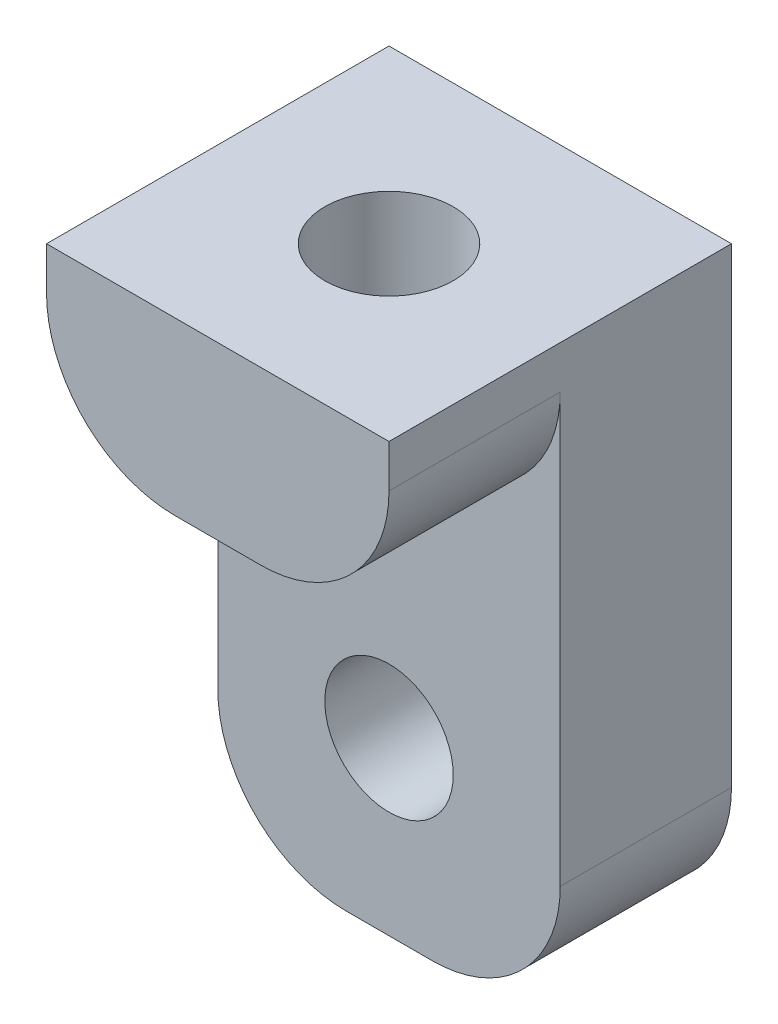
ISO-10303-21;
HEADER;
FILE_DESCRIPTION(('STEP AP214'),'2;1');
FILE_NAME('part.step','',(''),(''),'','','');
FILE_SCHEMA(('AUTOMOTIVE_DESIGN { 1 0 10303 214 1 1 1 1 }'));
ENDSEC;
DATA;
#1=APPLICATION_CONTEXT('core data for automotive mechanical design processes');
#2=APPLICATION_PROTOCOL_DEFINITION('international standard','automotive_design',2000,#1);
#3=PRODUCT_CONTEXT('',#1,'mechanical');
#4=PRODUCT('Part','Part','',(#3));
#5=PRODUCT_RELATED_PRODUCT_CATEGORY('part','',(#4));
#6=PRODUCT_DEFINITION_FORMATION('','',#4);
#7=PRODUCT_DEFINITION_CONTEXT('part definition',#1,'design');
#8=PRODUCT_DEFINITION('design','',#6,#7);
#9=PRODUCT_DEFINITION_SHAPE('','',#8);
#10=(LENGTH_UNIT() NAMED_UNIT(*) SI_UNIT(.MILLI.,.METRE.));
#11=(NAMED_UNIT(*) PLANE_ANGLE_UNIT() SI_UNIT($,.RADIAN.));
#12=(NAMED_UNIT(*) SI_UNIT($,.STERADIAN.) SOLID_ANGLE_UNIT());
#13=UNCERTAINTY_MEASURE_WITH_UNIT(LENGTH_MEASURE(1.E-05),#10,'distance_accuracy_value','');
#14=(GEOMETRIC_REPRESENTATION_CONTEXT(3) GLOBAL_UNCERTAINTY_ASSIGNED_CONTEXT((#13)) GLOBAL_UNIT_ASSIGNED_CONTEXT((#10,
#11,#12)) REPRESENTATION_CONTEXT('',''));
#15=CARTESIAN_POINT('',(0.,0.,0.));
#16=DIRECTION('',(0.,0.,1.));
#17=DIRECTION('',(1.,0.,0.));
#18=AXIS2_PLACEMENT_3D('',#15,#16,#17);
#19=CARTESIAN_POINT('',(0.,30.,0.));
#20=DIRECTION('',(0.,1.,0.));
#21=DIRECTION('',(0.,0.,1.));
#22=AXIS2_PLACEMENT_3D('',#19,#20,#21);
#23=PLANE('',#22);
#24=CARTESIAN_POINT('',(0.,30.,20.));
#25=DIRECTION('',(0.,1.,0.));
#26=DIRECTION('',(0.,0.,1.));
#27=AXIS2_PLACEMENT_3D('',#24,#25,#26);
#28=CIRCLE('',#27,7.5);
#29=CARTESIAN_POINT('',(7.5,30.,20.));
#30=VERTEX_POINT('',#29);
#31=CARTESIAN_POINT('',(-7.5,30.,20.));
#32=VERTEX_POINT('',#31);
#33=EDGE_CURVE('E50',#30,#32,#28,.T.);
#34=ORIENTED_EDGE('',*,*,#33,.T.);
#35=DIRECTION('',(1.,0.,0.));
#36=VECTOR('',#35,1.);
#37=CARTESIAN_POINT('',(-20.,30.,20.));
#38=LINE('',#37,#36);
#39=EDGE_CURVE('E53',#32,#30,#38,.T.);
#40=ORIENTED_EDGE('',*,*,#39,.T.);
#41=EDGE_LOOP('',(#34,#40));
#42=FACE_BOUND('',#41,.T.);
#43=ADVANCED_FACE('F36',(#42),#23,.T.);
#44=CARTESIAN_POINT('',(0.,0.,40.));
#45=DIRECTION('',(0.,0.,1.));
#46=DIRECTION('',(1.,0.,0.));
#47=AXIS2_PLACEMENT_3D('',#44,#45,#46);
#48=PLANE('',#47);
#49=DIRECTION('',(0.,-1.,0.));
#50=VECTOR('',#49,1.);
#51=CARTESIAN_POINT('',(-20.,50.,40.));
#52=LINE('',#51,#50);
#53=CARTESIAN_POINT('',(-20.,50.,40.));
#54=VERTEX_POINT('',#53);
#55=CARTESIAN_POINT('',(-20.,45.,40.));
#56=VERTEX_POINT('',#55);
#57=EDGE_CURVE('E133',#54,#56,#52,.T.);
#58=ORIENTED_EDGE('',*,*,#57,.T.);
#59=CARTESIAN_POINT('',(-5.00000000000001,45.,40.));
#60=DIRECTION('',(0.,0.,1.));
#61=DIRECTION('',(1.,0.,0.));
#62=AXIS2_PLACEMENT_3D('',#59,#60,#61);
#63=CIRCLE('',#62,15.);
#64=CARTESIAN_POINT('',(-5.00000000000001,30.,40.));
#65=VERTEX_POINT('',#64);
#66=EDGE_CURVE('E173',#56,#65,#63,.T.);
#67=ORIENTED_EDGE('',*,*,#66,.T.);
#68=DIRECTION('',(1.,0.,0.));
#69=VECTOR('',#68,1.);
#70=CARTESIAN_POINT('',(-20.,30.,40.));
#71=LINE('',#70,#69);
#72=CARTESIAN_POINT('',(5.00000000000001,30.,40.));
#73=VERTEX_POINT('',#72);
#74=EDGE_CURVE('E375',#65,#73,#71,.T.);
#75=ORIENTED_EDGE('',*,*,#74,.T.);
#76=CARTESIAN_POINT('',(5.00000000000001,45.,40.));
#77=DIRECTION('',(0.,0.,1.));
#78=DIRECTION('',(1.,0.,0.));
#79=AXIS2_PLACEMENT_3D('',#76,#77,#78);
#80=CIRCLE('',#79,15.);
#81=CARTESIAN_POINT('',(20.,45.,40.));
#82=VERTEX_POINT('',#81);
#83=EDGE_CURVE('E129',#73,#82,#80,.T.);
#84=ORIENTED_EDGE('',*,*,#83,.T.);
#85=DIRECTION('',(0.,1.,0.));
#86=VECTOR('',#85,1.);
#87=CARTESIAN_POINT('',(20.,50.,40.));
#88=LINE('',#87,#86);
#89=CARTESIAN_POINT('',(20.,50.,40.));
#90=VERTEX_POINT('',#89);
#91=EDGE_CURVE('E121',#82,#90,#88,.T.);
#92=ORIENTED_EDGE('',*,*,#91,.T.);
#93=DIRECTION('',(-1.,0.,0.));
#94=VECTOR('',#93,1.);
#95=CARTESIAN_POINT('',(-20.,50.,40.));
#96=LINE('',#95,#94);
#97=EDGE_CURVE('E126',#90,#54,#96,.T.);
#98=ORIENTED_EDGE('',*,*,#97,.T.);
#99=EDGE_LOOP('',(#58,#67,#75,#84,#92,#98));
#100=FACE_BOUND('',#99,.T.);
#101=ADVANCED_FACE('F124',(#100),#48,.T.);
#102=CARTESIAN_POINT('',(-20.,50.,40.));
#103=DIRECTION('',(1.,0.,0.));
#104=DIRECTION('',(0.,1.,0.));
#105=AXIS2_PLACEMENT_3D('',#102,#103,#104);
#106=PLANE('',#105);
#107=DIRECTION('',(0.,1.,0.));
#108=VECTOR('',#107,1.);
#109=CARTESIAN_POINT('',(-20.,-20.,20.));
#110=LINE('',#109,#108);
#111=CARTESIAN_POINT('',(-20.,-5.,20.));
#112=VERTEX_POINT('',#111);
#113=CARTESIAN_POINT('',(-20.,45.,20.));
#114=VERTEX_POINT('',#113);
#115=EDGE_CURVE('E167',#112,#114,#110,.T.);
#116=ORIENTED_EDGE('',*,*,#115,.T.);
#117=DIRECTION('',(0.,0.,1.));
#118=VECTOR('',#117,1.);
#119=CARTESIAN_POINT('',(-20.,45.,40.));
#120=LINE('',#119,#118);
#121=EDGE_CURVE('E169',#114,#56,#120,.T.);
#122=ORIENTED_EDGE('',*,*,#121,.T.);
#123=ORIENTED_EDGE('',*,*,#57,.F.);
#124=DIRECTION('',(0.,0.,-1.));
#125=VECTOR('',#124,1.);
#126=CARTESIAN_POINT('',(-20.,50.,40.));
#127=LINE('',#126,#125);
#128=CARTESIAN_POINT('',(-20.,50.,0.));
#129=VERTEX_POINT('',#128);
#130=EDGE_CURVE('E144',#54,#129,#127,.T.);
#131=ORIENTED_EDGE('',*,*,#130,.T.);
#132=DIRECTION('',(0.,-1.,0.));
#133=VECTOR('',#132,1.);
#134=CARTESIAN_POINT('',(-20.,50.,0.));
#135=LINE('',#134,#133);
#136=CARTESIAN_POINT('',(-20.,-5.,0.));
#137=VERTEX_POINT('',#136);
#138=EDGE_CURVE('E153',#129,#137,#135,.T.);
#139=ORIENTED_EDGE('',*,*,#138,.T.);
#140=DIRECTION('',(0.,0.,-1.));
#141=VECTOR('',#140,1.);
#142=CARTESIAN_POINT('',(-20.,-5.,40.));
#143=LINE('',#142,#141);
#144=EDGE_CURVE('E143',#137,#112,#143,.F.);
#145=ORIENTED_EDGE('',*,*,#144,.T.);
#146=EDGE_LOOP('',(#116,#122,#123,#131,#139,#145));
#147=FACE_BOUND('',#146,.T.);
#148=ADVANCED_FACE('F214',(#147),#106,.F.);
#149=CARTESIAN_POINT('',(-20.,-20.,40.));
#150=DIRECTION('',(0.,1.,0.));
#151=DIRECTION('',(0.,0.,1.));
#152=AXIS2_PLACEMENT_3D('',#149,#150,#151);
#153=PLANE('',#152);
#154=DIRECTION('',(1.,0.,0.));
#155=VECTOR('',#154,1.);
#156=CARTESIAN_POINT('',(-20.,-20.,0.));
#157=LINE('',#156,#155);
#158=CARTESIAN_POINT('',(-5.,-20.,0.));
#159=VERTEX_POINT('',#158);
#160=CARTESIAN_POINT('',(5.,-20.,0.));
#161=VERTEX_POINT('',#160);
#162=EDGE_CURVE('E156',#159,#161,#157,.T.);
#163=ORIENTED_EDGE('',*,*,#162,.T.);
#164=DIRECTION('',(0.,0.,-1.));
#165=VECTOR('',#164,1.);
#166=CARTESIAN_POINT('',(5.,-20.,40.));
#167=LINE('',#166,#165);
#168=CARTESIAN_POINT('',(5.,-20.,20.));
#169=VERTEX_POINT('',#168);
#170=EDGE_CURVE('E329',#161,#169,#167,.F.);
#171=ORIENTED_EDGE('',*,*,#170,.T.);
#172=DIRECTION('',(1.,0.,0.));
#173=VECTOR('',#172,1.);
#174=CARTESIAN_POINT('',(-20.,-20.,20.));
#175=LINE('',#174,#173);
#176=CARTESIAN_POINT('',(-5.,-20.,20.));
#177=VERTEX_POINT('',#176);
#178=EDGE_CURVE('E367',#177,#169,#175,.T.);
#179=ORIENTED_EDGE('',*,*,#178,.F.);
#180=DIRECTION('',(0.,0.,-1.));
#181=VECTOR('',#180,1.);
#182=CARTESIAN_POINT('',(-5.,-20.,40.));
#183=LINE('',#182,#181);
#184=EDGE_CURVE('E323',#177,#159,#183,.T.);
#185=ORIENTED_EDGE('',*,*,#184,.T.);
#186=EDGE_LOOP('',(#163,#171,#179,#185));
#187=FACE_BOUND('',#186,.T.);
#188=ADVANCED_FACE('F223',(#187),#153,.F.);
#189=CARTESIAN_POINT('',(20.,50.,40.));
#190=DIRECTION('',(-1.,0.,0.));
#191=DIRECTION('',(0.,-1.,0.));
#192=AXIS2_PLACEMENT_3D('',#189,#190,#191);
#193=PLANE('',#192);
#194=ORIENTED_EDGE('',*,*,#91,.F.);
#195=DIRECTION('',(0.,0.,1.));
#196=VECTOR('',#195,1.);
#197=CARTESIAN_POINT('',(20.,45.,20.));
#198=LINE('',#197,#196);
#199=CARTESIAN_POINT('',(20.,45.,20.));
#200=VERTEX_POINT('',#199);
#201=EDGE_CURVE('E357',#82,#200,#198,.F.);
#202=ORIENTED_EDGE('',*,*,#201,.T.);
#203=DIRECTION('',(0.,1.,0.));
#204=VECTOR('',#203,1.);
#205=CARTESIAN_POINT('',(20.,-20.,20.));
#206=LINE('',#205,#204);
#207=CARTESIAN_POINT('',(20.,-5.00000000000001,20.));
#208=VERTEX_POINT('',#207);
#209=EDGE_CURVE('E372',#208,#200,#206,.T.);
#210=ORIENTED_EDGE('',*,*,#209,.F.);
#211=DIRECTION('',(0.,0.,-1.));
#212=VECTOR('',#211,1.);
#213=CARTESIAN_POINT('',(20.,-5.,40.));
#214=LINE('',#213,#212);
#215=CARTESIAN_POINT('',(20.,-5.,0.));
#216=VERTEX_POINT('',#215);
#217=EDGE_CURVE('E360',#208,#216,#214,.T.);
#218=ORIENTED_EDGE('',*,*,#217,.T.);
#219=DIRECTION('',(0.,1.,0.));
#220=VECTOR('',#219,1.);
#221=CARTESIAN_POINT('',(20.,50.,0.));
#222=LINE('',#221,#220);
#223=CARTESIAN_POINT('',(20.,50.,0.));
#224=VERTEX_POINT('',#223);
#225=EDGE_CURVE('E140',#216,#224,#222,.T.);
#226=ORIENTED_EDGE('',*,*,#225,.T.);
#227=DIRECTION('',(0.,0.,-1.));
#228=VECTOR('',#227,1.);
#229=CARTESIAN_POINT('',(20.,50.,40.));
#230=LINE('',#229,#228);
#231=EDGE_CURVE('E136',#90,#224,#230,.T.);
#232=ORIENTED_EDGE('',*,*,#231,.F.);
#233=EDGE_LOOP('',(#194,#202,#210,#218,#226,#232));
#234=FACE_BOUND('',#233,.T.);
#235=ADVANCED_FACE('F137',(#234),#193,.F.);
#236=CARTESIAN_POINT('',(0.,0.,40.));
#237=DIRECTION('',(0.,0.,-1.));
#238=DIRECTION('',(-1.,0.,0.));
#239=AXIS2_PLACEMENT_3D('',#236,#237,#238);
#240=CYLINDRICAL_SURFACE('',#239,7.5);
#241=CARTESIAN_POINT('',(0.,0.,0.));
#242=DIRECTION('',(0.,0.,1.));
#243=DIRECTION('',(1.,0.,0.));
#244=AXIS2_PLACEMENT_3D('',#241,#242,#243);
#245=CIRCLE('',#244,7.5);
#246=CARTESIAN_POINT('',(7.5,0.,0.));
#247=VERTEX_POINT('',#246);
#248=EDGE_CURVE('E157',#247,#247,#245,.T.);
#249=ORIENTED_EDGE('',*,*,#248,.F.);
#250=EDGE_LOOP('',(#249));
#251=FACE_BOUND('',#250,.T.);
#252=CARTESIAN_POINT('',(0.,0.,20.));
#253=DIRECTION('',(0.,0.,1.));
#254=DIRECTION('',(1.,0.,0.));
#255=AXIS2_PLACEMENT_3D('',#252,#253,#254);
#256=CIRCLE('',#255,7.5);
#257=CARTESIAN_POINT('',(7.5,0.,20.));
#258=VERTEX_POINT('',#257);
#259=EDGE_CURVE('E163',#258,#258,#256,.T.);
#260=ORIENTED_EDGE('',*,*,#259,.T.);
#261=EDGE_LOOP('',(#260));
#262=FACE_BOUND('',#261,.T.);
#263=ADVANCED_FACE('F206',(#251,#262),#240,.F.);
#264=CARTESIAN_POINT('',(0.,0.,0.));
#265=DIRECTION('',(0.,0.,1.));
#266=DIRECTION('',(1.,0.,0.));
#267=AXIS2_PLACEMENT_3D('',#264,#265,#266);
#268=PLANE('',#267);
#269=ORIENTED_EDGE('',*,*,#225,.F.);
#270=CARTESIAN_POINT('',(5.,-5.,0.));
#271=DIRECTION('',(0.,0.,1.));
#272=DIRECTION('',(1.,0.,0.));
#273=AXIS2_PLACEMENT_3D('',#270,#271,#272);
#274=CIRCLE('',#273,15.);
#275=EDGE_CURVE('E362',#216,#161,#274,.F.);
#276=ORIENTED_EDGE('',*,*,#275,.T.);
#277=ORIENTED_EDGE('',*,*,#162,.F.);
#278=CARTESIAN_POINT('',(-5.,-5.,0.));
#279=DIRECTION('',(0.,0.,1.));
#280=DIRECTION('',(1.,0.,0.));
#281=AXIS2_PLACEMENT_3D('',#278,#279,#280);
#282=CIRCLE('',#281,15.);
#283=EDGE_CURVE('E359',#159,#137,#282,.F.);
#284=ORIENTED_EDGE('',*,*,#283,.T.);
#285=ORIENTED_EDGE('',*,*,#138,.F.);
#286=DIRECTION('',(-1.,0.,0.));
#287=VECTOR('',#286,1.);
#288=CARTESIAN_POINT('',(-20.,50.,0.));
#289=LINE('',#288,#287);
#290=EDGE_CURVE('E161',#224,#129,#289,.T.);
#291=ORIENTED_EDGE('',*,*,#290,.F.);
#292=EDGE_LOOP('',(#269,#276,#277,#284,#285,#291));
#293=FACE_BOUND('',#292,.T.);
#294=ORIENTED_EDGE('',*,*,#248,.T.);
#295=EDGE_LOOP('',(#294));
#296=FACE_BOUND('',#295,.T.);
#297=ADVANCED_FACE('F210',(#293,#296),#268,.F.);
#298=CARTESIAN_POINT('',(-20.,50.,40.));
#299=DIRECTION('',(0.,-1.,0.));
#300=DIRECTION('',(0.,0.,-1.));
#301=AXIS2_PLACEMENT_3D('',#298,#299,#300);
#302=PLANE('',#301);
#303=CARTESIAN_POINT('',(0.,50.,20.));
#304=DIRECTION('',(0.,1.,0.));
#305=DIRECTION('',(0.,0.,1.));
#306=AXIS2_PLACEMENT_3D('',#303,#304,#305);
#307=CIRCLE('',#306,7.5);
#308=CARTESIAN_POINT('',(0.,50.,27.5));
#309=VERTEX_POINT('',#308);
#310=EDGE_CURVE('E347',#309,#309,#307,.T.);
#311=ORIENTED_EDGE('',*,*,#310,.F.);
#312=EDGE_LOOP('',(#311));
#313=FACE_BOUND('',#312,.T.);
#314=ORIENTED_EDGE('',*,*,#290,.T.);
#315=ORIENTED_EDGE('',*,*,#130,.F.);
#316=ORIENTED_EDGE('',*,*,#97,.F.);
#317=ORIENTED_EDGE('',*,*,#231,.T.);
#318=EDGE_LOOP('',(#314,#315,#316,#317));
#319=FACE_BOUND('',#318,.T.);
#320=ADVANCED_FACE('F146',(#313,#319),#302,.F.);
#321=CARTESIAN_POINT('',(0.,30.,20.));
#322=DIRECTION('',(0.,1.,0.));
#323=DIRECTION('',(0.,0.,1.));
#324=AXIS2_PLACEMENT_3D('',#321,#322,#323);
#325=CYLINDRICAL_SURFACE('',#324,7.5);
#326=CARTESIAN_POINT('',(-5.00000000000001,30.,25.5901699437495));
#327=VERTEX_POINT('',#326);
#328=CARTESIAN_POINT('',(5.00000000000001,30.,25.5901699437495));
#329=VERTEX_POINT('',#328);
#330=EDGE_CURVE('E166',#327,#329,#28,.T.);
#331=ORIENTED_EDGE('',*,*,#330,.F.);
#332=CARTESIAN_POINT('',(-5.00000000000001,30.,25.5901699437495));
#333=CARTESIAN_POINT('',(-5.15663344575459,29.9999978303104,25.4501051414938));
#334=CARTESIAN_POINT('',(-5.3073275431487,30.0024537237757,25.3034421050508));
#335=CARTESIAN_POINT('',(-5.59580804645587,30.0111435883526,24.9980934292791));
#336=CARTESIAN_POINT('',(-5.73359757609519,30.0173766424079,24.8394107163865));
#337=CARTESIAN_POINT('',(-5.9952148366046,30.0324779884707,24.5112555362672));
#338=CARTESIAN_POINT('',(-6.11905337737117,30.0413442205223,24.3417915844213));
#339=CARTESIAN_POINT('',(-6.35206901812086,30.0606030984697,23.9931413005001));
#340=CARTESIAN_POINT('',(-6.46124549102694,30.0709958096114,23.8139545530537));
#341=CARTESIAN_POINT('',(-6.66418146031627,30.0922532551697,23.4471174990133));
#342=CARTESIAN_POINT('',(-6.75794330805307,30.1031179172747,23.2594684888317));
#343=CARTESIAN_POINT('',(-6.92943411166735,30.1243570340514,22.8769554999541));
#344=CARTESIAN_POINT('',(-7.00716314928027,30.1347314912221,22.6820915580459));
#345=CARTESIAN_POINT('',(-7.14603413692196,30.1541434492909,22.2865105169181));
#346=CARTESIAN_POINT('',(-7.20717888242539,30.1631811753936,22.0857944104737));
#347=CARTESIAN_POINT('',(-7.31245566261449,30.1792244585586,21.6798679055726));
#348=CARTESIAN_POINT('',(-7.35658773370456,30.1862300199695,21.4746575167339));
#349=CARTESIAN_POINT('',(-7.42766500485304,30.197711400443,21.0602728203928));
#350=CARTESIAN_POINT('',(-7.45453326021265,30.2021758839963,20.8510849871964));
#351=CARTESIAN_POINT('',(-7.4905623375704,30.2081970563272,20.4311464946836));
#352=CARTESIAN_POINT('',(-7.49972308710657,30.2097537332054,20.2203958289755));
#353=CARTESIAN_POINT('',(-7.50026453144197,30.209845257095,19.7988770384197));
#354=CARTESIAN_POINT('',(-7.49164572593858,30.208380189033,19.5881089142293));
#355=CARTESIAN_POINT('',(-7.4566972072208,30.2025356376118,19.168089030511));
#356=CARTESIAN_POINT('',(-7.43036763231109,30.1981561770114,18.9588372591547));
#357=CARTESIAN_POINT('',(-7.36064799928905,30.1868785261535,18.5459946810235));
#358=CARTESIAN_POINT('',(-7.31747808101943,30.1800129151642,18.3423657457407));
#359=CARTESIAN_POINT('',(-7.21436986767921,30.1642565396045,17.9393826214284));
#360=CARTESIAN_POINT('',(-7.1544240551411,30.155364867466,17.7400303920576));
#361=CARTESIAN_POINT('',(-7.01818739304532,30.136230367199,17.3470188916852));
#362=CARTESIAN_POINT('',(-6.94189353402911,30.1259872904285,17.1533606763506));
#363=CARTESIAN_POINT('',(-6.77353044043229,30.1049746885494,16.7731604847035));
#364=CARTESIAN_POINT('',(-6.68146805943197,30.0942053936019,16.5866154596231));
#365=CARTESIAN_POINT('',(-6.47973744880901,30.0728131023185,16.2173651672977));
#366=CARTESIAN_POINT('',(-6.36969614342315,30.0622000006072,16.0348629815442));
#367=CARTESIAN_POINT('',(-6.13444857364372,30.0424950294228,15.6798268314861));
#368=CARTESIAN_POINT('',(-6.00924263972168,30.0334031268096,15.5072926500773));
#369=CARTESIAN_POINT('',(-5.74439588116251,30.0178948657955,15.1732662989898));
#370=CARTESIAN_POINT('',(-5.60474096731799,30.0114811501685,15.0117851669272));
#371=CARTESIAN_POINT('',(-5.31210296626037,30.0025321683687,14.7012075626924));
#372=CARTESIAN_POINT('',(-5.15911680082515,29.9999978004693,14.5521139664433));
#373=CARTESIAN_POINT('',(-5.00000000000001,30.,14.4098300562505));
#374=B_SPLINE_CURVE_WITH_KNOTS('',3,(#332,#333,#334,#335,#336,#337,#338,#339,#340,#341,#342,
#343,#344,#345,#346,#347,#348,#349,#350,#351,#352,#353,#354,#355,#356,#357,#358,#359,#360,#361,
#362,#363,#364,#365,#366,#367,#368,#369,#370,#371,#372,#373),.UNSPECIFIED.,.F.,.F.,(4,2,2,2,2,2,
2,2,2,2,2,2,2,2,2,2,2,2,2,2,4),(0.,0.630131786436628,1.26011064450682,1.88959795754474,
2.51911218434564,3.14853029549866,3.77794519779274,4.40725393888138,5.03656133334271,
5.66865443913941,6.30075013155758,6.93282805906215,7.56490105068162,8.18897434663032,
8.81332774589868,9.43779617923999,10.0619938811669,10.7013413169057,11.3406748223251,
11.9806377250904,12.620748790577),.UNSPECIFIED.);
#375=CARTESIAN_POINT('',(-7.5,30.209800542251,20.));
#376=VERTEX_POINT('',#375);
#377=EDGE_CURVE('E189',#327,#376,#374,.T.);
#378=ORIENTED_EDGE('',*,*,#377,.T.);
#379=DIRECTION('',(0.,1.,0.));
#380=VECTOR('',#379,1.);
#381=CARTESIAN_POINT('',(-7.5,30.,20.));
#382=LINE('',#381,#380);
#383=EDGE_CURVE('E11',#376,#32,#382,.F.);
#384=ORIENTED_EDGE('',*,*,#383,.T.);
#385=ORIENTED_EDGE('',*,*,#33,.F.);
#386=DIRECTION('',(0.,1.,0.));
#387=VECTOR('',#386,1.);
#388=CARTESIAN_POINT('',(7.5,30.,20.));
#389=LINE('',#388,#387);
#390=CARTESIAN_POINT('',(7.5,30.209800542251,20.));
#391=VERTEX_POINT('',#390);
#392=EDGE_CURVE('E44',#391,#30,#389,.F.);
#393=ORIENTED_EDGE('',*,*,#392,.F.);
#394=CARTESIAN_POINT('',(5.00000000000001,30.,14.4098300562505));
#395=CARTESIAN_POINT('',(5.15663344575459,29.9999978303104,14.5498948585062));
#396=CARTESIAN_POINT('',(5.30732754314871,30.0024537237757,14.6965578949492));
#397=CARTESIAN_POINT('',(5.59580804645587,30.0111435883526,15.0019065707209));
#398=CARTESIAN_POINT('',(5.7335975760952,30.0173766424079,15.1605892836135));
#399=CARTESIAN_POINT('',(5.9952148366046,30.0324779884707,15.4887444637328));
#400=CARTESIAN_POINT('',(6.11905337737117,30.0413442205223,15.6582084155787));
#401=CARTESIAN_POINT('',(6.35206901812087,30.0606030984697,16.0068586994999));
#402=CARTESIAN_POINT('',(6.46124549102694,30.0709958096114,16.1860454469463));
#403=CARTESIAN_POINT('',(6.66418146031628,30.0922532551697,16.5528825009867));
#404=CARTESIAN_POINT('',(6.75794330805307,30.1031179172747,16.7405315111683));
#405=CARTESIAN_POINT('',(6.92943411166736,30.1243570340514,17.1230445000459));
#406=CARTESIAN_POINT('',(7.00716314928027,30.1347314912221,17.3179084419541));
#407=CARTESIAN_POINT('',(7.14603413692196,30.1541434492909,17.7134894830819));
#408=CARTESIAN_POINT('',(7.20717888242539,30.1631811753936,17.9142055895263));
#409=CARTESIAN_POINT('',(7.3124556626145,30.1792244585586,18.3201320944274));
#410=CARTESIAN_POINT('',(7.35658773370457,30.1862300199695,18.5253424832661));
#411=CARTESIAN_POINT('',(7.42766500485304,30.197711400443,18.9397271796072));
#412=CARTESIAN_POINT('',(7.45453326021265,30.2021758839963,19.1489150128036));
#413=CARTESIAN_POINT('',(7.4905623375704,30.2081970563272,19.5688535053164));
#414=CARTESIAN_POINT('',(7.49972308710657,30.2097537332054,19.7796041710245));
#415=CARTESIAN_POINT('',(7.50026453144198,30.209845257095,20.2011229615803));
#416=CARTESIAN_POINT('',(7.49164572593859,30.208380189033,20.4118910857707));
#417=CARTESIAN_POINT('',(7.45669720722081,30.2025356376118,20.831910969489));
#418=CARTESIAN_POINT('',(7.4303676323111,30.1981561770114,21.0411627408453));
#419=CARTESIAN_POINT('',(7.36064799928906,30.1868785261535,21.4540053189765));
#420=CARTESIAN_POINT('',(7.31747808101944,30.1800129151642,21.6576342542593));
#421=CARTESIAN_POINT('',(7.21436986767922,30.1642565396045,22.0606173785716));
#422=CARTESIAN_POINT('',(7.15442405514111,30.155364867466,22.2599696079424));
#423=CARTESIAN_POINT('',(7.01818739304532,30.136230367199,22.6529811083148));
#424=CARTESIAN_POINT('',(6.94189353402912,30.1259872904285,22.8466393236494));
#425=CARTESIAN_POINT('',(6.7735304404323,30.1049746885494,23.2268395152965));
#426=CARTESIAN_POINT('',(6.68146805943198,30.0942053936019,23.4133845403769));
#427=CARTESIAN_POINT('',(6.47973744880902,30.0728131023185,23.7826348327023));
#428=CARTESIAN_POINT('',(6.36969614342316,30.0622000006072,23.9651370184558));
#429=CARTESIAN_POINT('',(6.13444857364373,30.0424950294228,24.3201731685139));
#430=CARTESIAN_POINT('',(6.00924263972169,30.0334031268096,24.4927073499227));
#431=CARTESIAN_POINT('',(5.74439588116252,30.0178948657955,24.8267337010102));
#432=CARTESIAN_POINT('',(5.604740967318,30.0114811501685,24.9882148330728));
#433=CARTESIAN_POINT('',(5.31210296626037,30.0025321683687,25.2987924373076));
#434=CARTESIAN_POINT('',(5.15911680082516,29.9999978004693,25.4478860335567));
#435=CARTESIAN_POINT('',(5.00000000000001,30.,25.5901699437495));
#436=B_SPLINE_CURVE_WITH_KNOTS('',3,(#394,#395,#396,#397,#398,#399,#400,#401,#402,#403,#404,
#405,#406,#407,#408,#409,#410,#411,#412,#413,#414,#415,#416,#417,#418,#419,#420,#421,#422,#423,
#424,#425,#426,#427,#428,#429,#430,#431,#432,#433,#434,#435),.UNSPECIFIED.,.F.,.F.,(4,2,2,2,2,2,
2,2,2,2,2,2,2,2,2,2,2,2,2,2,4),(0.,0.630131786436628,1.26011064450682,1.88959795754474,
2.51911218434564,3.14853029549866,3.77794519779275,4.40725393888139,5.03656133334272,
5.66865443913942,6.30075013155758,6.93282805906215,7.56490105068163,8.18897434663033,
8.81332774589869,9.43779617923999,10.0619938811669,10.7013413169057,11.3406748223252,
11.9806377250904,12.620748790577),.UNSPECIFIED.);
#437=EDGE_CURVE('E181',#391,#329,#436,.T.);
#438=ORIENTED_EDGE('',*,*,#437,.T.);
#439=EDGE_LOOP('',(#331,#378,#384,#385,#393,#438));
#440=FACE_BOUND('',#439,.T.);
#441=ORIENTED_EDGE('',*,*,#310,.T.);
#442=EDGE_LOOP('',(#441));
#443=FACE_BOUND('',#442,.T.);
#444=ADVANCED_FACE('F198',(#440,#443),#325,.F.);
#445=CARTESIAN_POINT('',(-20.,30.,20.));
#446=DIRECTION('',(0.,-1.,0.));
#447=DIRECTION('',(0.,0.,-1.));
#448=AXIS2_PLACEMENT_3D('',#445,#446,#447);
#449=PLANE('',#448);
#450=ORIENTED_EDGE('',*,*,#74,.F.);
#451=DIRECTION('',(0.,0.,1.));
#452=VECTOR('',#451,1.);
#453=CARTESIAN_POINT('',(-5.00000000000001,30.,20.));
#454=LINE('',#453,#452);
#455=EDGE_CURVE('E178',#65,#327,#454,.F.);
#456=ORIENTED_EDGE('',*,*,#455,.T.);
#457=ORIENTED_EDGE('',*,*,#330,.T.);
#458=DIRECTION('',(0.,0.,1.));
#459=VECTOR('',#458,1.);
#460=CARTESIAN_POINT('',(5.00000000000001,30.,40.));
#461=LINE('',#460,#459);
#462=EDGE_CURVE('E175',#329,#73,#461,.T.);
#463=ORIENTED_EDGE('',*,*,#462,.T.);
#464=EDGE_LOOP('',(#450,#456,#457,#463));
#465=FACE_BOUND('',#464,.T.);
#466=ADVANCED_FACE('F203',(#465),#449,.T.);
#467=CARTESIAN_POINT('',(0.,0.,20.));
#468=DIRECTION('',(0.,0.,1.));
#469=DIRECTION('',(1.,0.,0.));
#470=AXIS2_PLACEMENT_3D('',#467,#468,#469);
#471=PLANE('',#470);
#472=ORIENTED_EDGE('',*,*,#259,.F.);
#473=EDGE_LOOP('',(#472));
#474=FACE_BOUND('',#473,.T.);
#475=ORIENTED_EDGE('',*,*,#178,.T.);
#476=CARTESIAN_POINT('',(5.,-5.,20.));
#477=DIRECTION('',(0.,0.,1.));
#478=DIRECTION('',(1.,0.,0.));
#479=AXIS2_PLACEMENT_3D('',#476,#477,#478);
#480=CIRCLE('',#479,15.);
#481=EDGE_CURVE('E328',#169,#208,#480,.T.);
#482=ORIENTED_EDGE('',*,*,#481,.T.);
#483=ORIENTED_EDGE('',*,*,#209,.T.);
#484=CARTESIAN_POINT('',(5.00000000000001,45.,20.));
#485=DIRECTION('',(0.,0.,1.));
#486=DIRECTION('',(1.,0.,0.));
#487=AXIS2_PLACEMENT_3D('',#484,#485,#486);
#488=CIRCLE('',#487,15.);
#489=EDGE_CURVE('E338',#200,#391,#488,.F.);
#490=ORIENTED_EDGE('',*,*,#489,.T.);
#491=ORIENTED_EDGE('',*,*,#392,.T.);
#492=ORIENTED_EDGE('',*,*,#39,.F.);
#493=ORIENTED_EDGE('',*,*,#383,.F.);
#494=CARTESIAN_POINT('',(-5.00000000000001,45.,20.));
#495=DIRECTION('',(0.,0.,1.));
#496=DIRECTION('',(1.,0.,0.));
#497=AXIS2_PLACEMENT_3D('',#494,#495,#496);
#498=CIRCLE('',#497,15.);
#499=EDGE_CURVE('E331',#376,#114,#498,.F.);
#500=ORIENTED_EDGE('',*,*,#499,.T.);
#501=ORIENTED_EDGE('',*,*,#115,.F.);
#502=CARTESIAN_POINT('',(-5.,-5.,20.));
#503=DIRECTION('',(0.,0.,1.));
#504=DIRECTION('',(1.,0.,0.));
#505=AXIS2_PLACEMENT_3D('',#502,#503,#504);
#506=CIRCLE('',#505,15.);
#507=EDGE_CURVE('E321',#112,#177,#506,.T.);
#508=ORIENTED_EDGE('',*,*,#507,.T.);
#509=EDGE_LOOP('',(#475,#482,#483,#490,#491,#492,#493,#500,#501,#508));
#510=FACE_BOUND('',#509,.T.);
#511=ADVANCED_FACE('F232',(#474,#510),#471,.T.);
#512=CARTESIAN_POINT('',(-5.00000000000001,45.,40.));
#513=DIRECTION('',(0.,0.,-1.));
#514=DIRECTION('',(-1.,0.,0.));
#515=AXIS2_PLACEMENT_3D('',#512,#513,#514);
#516=CYLINDRICAL_SURFACE('',#515,15.);
#517=ORIENTED_EDGE('',*,*,#499,.F.);
#518=ORIENTED_EDGE('',*,*,#377,.F.);
#519=ORIENTED_EDGE('',*,*,#455,.F.);
#520=ORIENTED_EDGE('',*,*,#66,.F.);
#521=ORIENTED_EDGE('',*,*,#121,.F.);
#522=EDGE_LOOP('',(#517,#518,#519,#520,#521));
#523=FACE_BOUND('',#522,.T.);
#524=ADVANCED_FACE('F229',(#523),#516,.T.);
#525=CARTESIAN_POINT('',(5.00000000000001,45.,20.));
#526=DIRECTION('',(0.,0.,-1.));
#527=DIRECTION('',(-1.,0.,0.));
#528=AXIS2_PLACEMENT_3D('',#525,#526,#527);
#529=CYLINDRICAL_SURFACE('',#528,15.);
#530=ORIENTED_EDGE('',*,*,#437,.F.);
#531=ORIENTED_EDGE('',*,*,#489,.F.);
#532=ORIENTED_EDGE('',*,*,#201,.F.);
#533=ORIENTED_EDGE('',*,*,#83,.F.);
#534=ORIENTED_EDGE('',*,*,#462,.F.);
#535=EDGE_LOOP('',(#530,#531,#532,#533,#534));
#536=FACE_BOUND('',#535,.T.);
#537=ADVANCED_FACE('F196',(#536),#529,.T.);
#538=CARTESIAN_POINT('',(5.,-5.,40.));
#539=DIRECTION('',(0.,0.,-1.));
#540=DIRECTION('',(-1.,0.,0.));
#541=AXIS2_PLACEMENT_3D('',#538,#539,#540);
#542=CYLINDRICAL_SURFACE('',#541,15.);
#543=ORIENTED_EDGE('',*,*,#481,.F.);
#544=ORIENTED_EDGE('',*,*,#170,.F.);
#545=ORIENTED_EDGE('',*,*,#275,.F.);
#546=ORIENTED_EDGE('',*,*,#217,.F.);
#547=EDGE_LOOP('',(#543,#544,#545,#546));
#548=FACE_BOUND('',#547,.T.);
#549=ADVANCED_FACE('F238',(#548),#542,.T.);
#550=CARTESIAN_POINT('',(-5.,-5.,40.));
#551=DIRECTION('',(0.,0.,-1.));
#552=DIRECTION('',(-1.,0.,0.));
#553=AXIS2_PLACEMENT_3D('',#550,#551,#552);
#554=CYLINDRICAL_SURFACE('',#553,15.);
#555=ORIENTED_EDGE('',*,*,#507,.F.);
#556=ORIENTED_EDGE('',*,*,#144,.F.);
#557=ORIENTED_EDGE('',*,*,#283,.F.);
#558=ORIENTED_EDGE('',*,*,#184,.F.);
#559=EDGE_LOOP('',(#555,#556,#557,#558));
#560=FACE_BOUND('',#559,.T.);
#561=ADVANCED_FACE('F38',(#560),#554,.T.);
#562=CLOSED_SHELL('',(#43,#101,#148,#188,#235,#263,#297,#320,#444,#466,#511,#524,#537,#549,#561));
#563=MANIFOLD_SOLID_BREP('B2',#562);
#564=ADVANCED_BREP_SHAPE_REPRESENTATION('',(#18,#563),#14);
#565=SHAPE_DEFINITION_REPRESENTATION(#9,#564);
ENDSEC;
END-ISO-10303-21;
